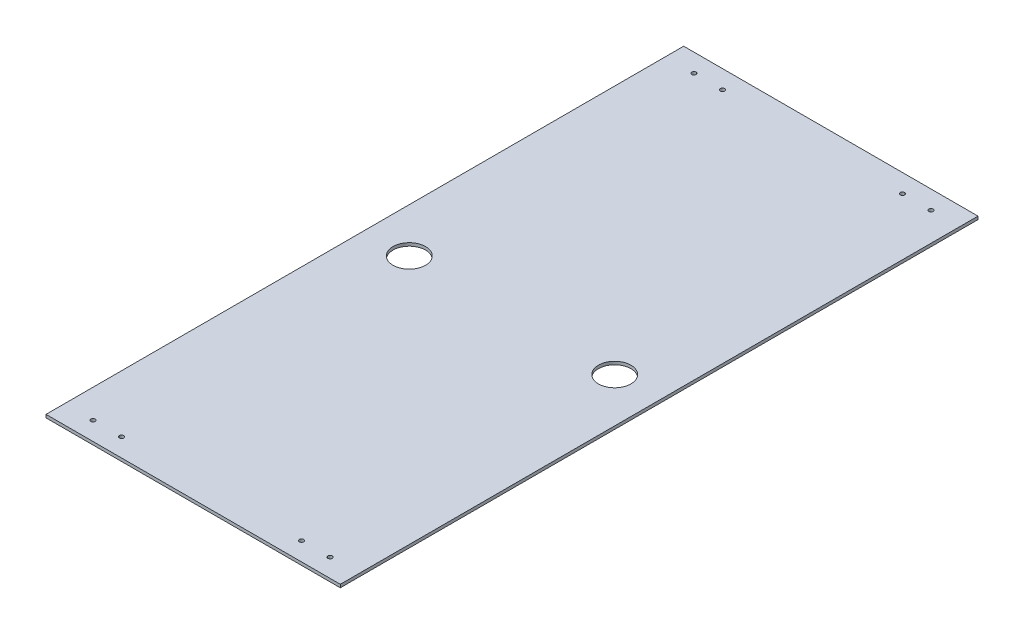
ISO-10303-21;
HEADER;
FILE_DESCRIPTION(('STEP AP214'),'2;1');
FILE_NAME('part.step','',(''),(''),'','','');
FILE_SCHEMA(('AUTOMOTIVE_DESIGN { 1 0 10303 214 1 1 1 1 }'));
ENDSEC;
DATA;
#1=APPLICATION_CONTEXT('core data for automotive mechanical design processes');
#2=APPLICATION_PROTOCOL_DEFINITION('international standard','automotive_design',2000,#1);
#3=PRODUCT_CONTEXT('',#1,'mechanical');
#4=PRODUCT('Part','Part','',(#3));
#5=PRODUCT_RELATED_PRODUCT_CATEGORY('part','',(#4));
#6=PRODUCT_DEFINITION_FORMATION('','',#4);
#7=PRODUCT_DEFINITION_CONTEXT('part definition',#1,'design');
#8=PRODUCT_DEFINITION('design','',#6,#7);
#9=PRODUCT_DEFINITION_SHAPE('','',#8);
#10=(LENGTH_UNIT() NAMED_UNIT(*) SI_UNIT(.MILLI.,.METRE.));
#11=(NAMED_UNIT(*) PLANE_ANGLE_UNIT() SI_UNIT($,.RADIAN.));
#12=(NAMED_UNIT(*) SI_UNIT($,.STERADIAN.) SOLID_ANGLE_UNIT());
#13=UNCERTAINTY_MEASURE_WITH_UNIT(LENGTH_MEASURE(1.E-05),#10,'distance_accuracy_value','');
#14=(GEOMETRIC_REPRESENTATION_CONTEXT(3) GLOBAL_UNCERTAINTY_ASSIGNED_CONTEXT((#13)) GLOBAL_UNIT_ASSIGNED_CONTEXT((#10,
#11,#12)) REPRESENTATION_CONTEXT('',''));
#15=CARTESIAN_POINT('',(0.,0.,0.));
#16=DIRECTION('',(0.,0.,1.));
#17=DIRECTION('',(1.,0.,0.));
#18=AXIS2_PLACEMENT_3D('',#15,#16,#17);
#19=CARTESIAN_POINT('',(0.,3.175,0.));
#20=DIRECTION('',(0.,-1.,0.));
#21=DIRECTION('',(0.,0.,-1.));
#22=AXIS2_PLACEMENT_3D('',#19,#20,#21);
#23=PLANE('',#22);
#24=DIRECTION('',(0.,0.,1.));
#25=VECTOR('',#24,1.);
#26=CARTESIAN_POINT('',(0.,3.175,0.));
#27=LINE('',#26,#25);
#28=CARTESIAN_POINT('',(0.,3.175,-660.4));
#29=VERTEX_POINT('',#28);
#30=CARTESIAN_POINT('',(0.,3.175,0.));
#31=VERTEX_POINT('',#30);
#32=EDGE_CURVE('E85',#29,#31,#27,.T.);
#33=ORIENTED_EDGE('',*,*,#32,.T.);
#34=DIRECTION('',(1.,0.,0.));
#35=VECTOR('',#34,1.);
#36=CARTESIAN_POINT('',(0.,3.175,0.));
#37=LINE('',#36,#35);
#38=CARTESIAN_POINT('',(304.8,3.175,0.));
#39=VERTEX_POINT('',#38);
#40=EDGE_CURVE('E80',#31,#39,#37,.T.);
#41=ORIENTED_EDGE('',*,*,#40,.T.);
#42=DIRECTION('',(0.,0.,-1.));
#43=VECTOR('',#42,1.);
#44=CARTESIAN_POINT('',(304.8,3.175,0.));
#45=LINE('',#44,#43);
#46=CARTESIAN_POINT('',(304.8,3.175,-660.4));
#47=VERTEX_POINT('',#46);
#48=EDGE_CURVE('E83',#39,#47,#45,.T.);
#49=ORIENTED_EDGE('',*,*,#48,.T.);
#50=DIRECTION('',(-1.,0.,0.));
#51=VECTOR('',#50,1.);
#52=CARTESIAN_POINT('',(0.,3.175,-660.4));
#53=LINE('',#52,#51);
#54=EDGE_CURVE('E50',#47,#29,#53,.T.);
#55=ORIENTED_EDGE('',*,*,#54,.T.);
#56=EDGE_LOOP('',(#33,#41,#49,#55));
#57=FACE_BOUND('',#56,.T.);
#58=CARTESIAN_POINT('',(46.0248,3.175,-330.2));
#59=DIRECTION('',(0.,1.,0.));
#60=DIRECTION('',(0.,0.,1.));
#61=AXIS2_PLACEMENT_3D('',#58,#59,#60);
#62=CIRCLE('',#61,16.8275);
#63=CARTESIAN_POINT('',(46.0248,3.175,-313.3725));
#64=VERTEX_POINT('',#63);
#65=EDGE_CURVE('E100',#64,#64,#62,.T.);
#66=ORIENTED_EDGE('',*,*,#65,.F.);
#67=EDGE_LOOP('',(#66));
#68=FACE_BOUND('',#67,.T.);
#69=CARTESIAN_POINT('',(258.7752,3.175,-330.2));
#70=DIRECTION('',(0.,1.,0.));
#71=DIRECTION('',(0.,0.,1.));
#72=AXIS2_PLACEMENT_3D('',#69,#70,#71);
#73=CIRCLE('',#72,16.8275);
#74=CARTESIAN_POINT('',(258.7752,3.175,-313.3725));
#75=VERTEX_POINT('',#74);
#76=EDGE_CURVE('E115',#75,#75,#73,.T.);
#77=ORIENTED_EDGE('',*,*,#76,.F.);
#78=EDGE_LOOP('',(#77));
#79=FACE_BOUND('',#78,.T.);
#80=CARTESIAN_POINT('',(29.6333333333333,3.175,-19.05));
#81=DIRECTION('',(0.,1.,0.));
#82=DIRECTION('',(0.,0.,1.));
#83=AXIS2_PLACEMENT_3D('',#80,#81,#82);
#84=CIRCLE('',#83,2.2479);
#85=CARTESIAN_POINT('',(29.6333333333333,3.175,-16.8021));
#86=VERTEX_POINT('',#85);
#87=EDGE_CURVE('E121',#86,#86,#84,.T.);
#88=ORIENTED_EDGE('',*,*,#87,.F.);
#89=EDGE_LOOP('',(#88));
#90=FACE_BOUND('',#89,.T.);
#91=CARTESIAN_POINT('',(59.2666666666667,3.175,-19.05));
#92=DIRECTION('',(0.,1.,0.));
#93=DIRECTION('',(0.,0.,1.));
#94=AXIS2_PLACEMENT_3D('',#91,#92,#93);
#95=CIRCLE('',#94,2.24789999999999);
#96=CARTESIAN_POINT('',(59.2666666666667,3.175,-16.8021));
#97=VERTEX_POINT('',#96);
#98=EDGE_CURVE('E127',#97,#97,#95,.T.);
#99=ORIENTED_EDGE('',*,*,#98,.F.);
#100=EDGE_LOOP('',(#99));
#101=FACE_BOUND('',#100,.T.);
#102=CARTESIAN_POINT('',(245.533333333333,3.175,-19.05));
#103=DIRECTION('',(0.,1.,0.));
#104=DIRECTION('',(0.,0.,1.));
#105=AXIS2_PLACEMENT_3D('',#102,#103,#104);
#106=CIRCLE('',#105,2.2479);
#107=CARTESIAN_POINT('',(245.533333333333,3.175,-16.8021));
#108=VERTEX_POINT('',#107);
#109=EDGE_CURVE('E133',#108,#108,#106,.T.);
#110=ORIENTED_EDGE('',*,*,#109,.F.);
#111=EDGE_LOOP('',(#110));
#112=FACE_BOUND('',#111,.T.);
#113=CARTESIAN_POINT('',(275.166666666667,3.175,-19.05));
#114=DIRECTION('',(0.,1.,0.));
#115=DIRECTION('',(0.,0.,1.));
#116=AXIS2_PLACEMENT_3D('',#113,#114,#115);
#117=CIRCLE('',#116,2.24790000000001);
#118=CARTESIAN_POINT('',(275.166666666667,3.175,-16.8021));
#119=VERTEX_POINT('',#118);
#120=EDGE_CURVE('E139',#119,#119,#117,.T.);
#121=ORIENTED_EDGE('',*,*,#120,.F.);
#122=EDGE_LOOP('',(#121));
#123=FACE_BOUND('',#122,.T.);
#124=CARTESIAN_POINT('',(275.166666666667,3.175,-641.35));
#125=DIRECTION('',(0.,1.,0.));
#126=DIRECTION('',(0.,0.,1.));
#127=AXIS2_PLACEMENT_3D('',#124,#125,#126);
#128=CIRCLE('',#127,2.24790000000002);
#129=CARTESIAN_POINT('',(275.166666666667,3.175,-639.1021));
#130=VERTEX_POINT('',#129);
#131=EDGE_CURVE('E145',#130,#130,#128,.T.);
#132=ORIENTED_EDGE('',*,*,#131,.F.);
#133=EDGE_LOOP('',(#132));
#134=FACE_BOUND('',#133,.T.);
#135=CARTESIAN_POINT('',(245.533333333333,3.175,-641.35));
#136=DIRECTION('',(0.,1.,0.));
#137=DIRECTION('',(0.,0.,1.));
#138=AXIS2_PLACEMENT_3D('',#135,#136,#137);
#139=CIRCLE('',#138,2.24790000000004);
#140=CARTESIAN_POINT('',(245.533333333333,3.175,-639.1021));
#141=VERTEX_POINT('',#140);
#142=EDGE_CURVE('E151',#141,#141,#139,.T.);
#143=ORIENTED_EDGE('',*,*,#142,.F.);
#144=EDGE_LOOP('',(#143));
#145=FACE_BOUND('',#144,.T.);
#146=CARTESIAN_POINT('',(59.2666666666667,3.175,-641.35));
#147=DIRECTION('',(0.,1.,0.));
#148=DIRECTION('',(0.,0.,1.));
#149=AXIS2_PLACEMENT_3D('',#146,#147,#148);
#150=CIRCLE('',#149,2.24790000000002);
#151=CARTESIAN_POINT('',(59.2666666666667,3.175,-639.1021));
#152=VERTEX_POINT('',#151);
#153=EDGE_CURVE('E157',#152,#152,#150,.T.);
#154=ORIENTED_EDGE('',*,*,#153,.F.);
#155=EDGE_LOOP('',(#154));
#156=FACE_BOUND('',#155,.T.);
#157=CARTESIAN_POINT('',(29.6333333333333,3.175,-641.35));
#158=DIRECTION('',(0.,1.,0.));
#159=DIRECTION('',(0.,0.,1.));
#160=AXIS2_PLACEMENT_3D('',#157,#158,#159);
#161=CIRCLE('',#160,2.24790000000003);
#162=CARTESIAN_POINT('',(29.6333333333333,3.175,-639.1021));
#163=VERTEX_POINT('',#162);
#164=EDGE_CURVE('E163',#163,#163,#161,.T.);
#165=ORIENTED_EDGE('',*,*,#164,.F.);
#166=EDGE_LOOP('',(#165));
#167=FACE_BOUND('',#166,.T.);
#168=ADVANCED_FACE('F33',(#57,#68,#79,#90,#101,#112,#123,#134,#145,#156,#167),#23,.F.);
#169=CARTESIAN_POINT('',(0.,0.,0.));
#170=DIRECTION('',(0.,-1.,0.));
#171=DIRECTION('',(0.,0.,-1.));
#172=AXIS2_PLACEMENT_3D('',#169,#170,#171);
#173=PLANE('',#172);
#174=CARTESIAN_POINT('',(59.2666666666667,0.,-641.35));
#175=DIRECTION('',(0.,1.,0.));
#176=DIRECTION('',(0.,0.,1.));
#177=AXIS2_PLACEMENT_3D('',#174,#175,#176);
#178=CIRCLE('',#177,2.24790000000002);
#179=CARTESIAN_POINT('',(59.2666666666667,0.,-639.1021));
#180=VERTEX_POINT('',#179);
#181=EDGE_CURVE('E160',#180,#180,#178,.T.);
#182=ORIENTED_EDGE('',*,*,#181,.T.);
#183=EDGE_LOOP('',(#182));
#184=FACE_BOUND('',#183,.T.);
#185=CARTESIAN_POINT('',(275.166666666667,0.,-641.35));
#186=DIRECTION('',(0.,1.,0.));
#187=DIRECTION('',(0.,0.,1.));
#188=AXIS2_PLACEMENT_3D('',#185,#186,#187);
#189=CIRCLE('',#188,2.24790000000002);
#190=CARTESIAN_POINT('',(275.166666666667,0.,-639.1021));
#191=VERTEX_POINT('',#190);
#192=EDGE_CURVE('E148',#191,#191,#189,.T.);
#193=ORIENTED_EDGE('',*,*,#192,.T.);
#194=EDGE_LOOP('',(#193));
#195=FACE_BOUND('',#194,.T.);
#196=CARTESIAN_POINT('',(245.533333333333,0.,-19.05));
#197=DIRECTION('',(0.,1.,0.));
#198=DIRECTION('',(0.,0.,1.));
#199=AXIS2_PLACEMENT_3D('',#196,#197,#198);
#200=CIRCLE('',#199,2.2479);
#201=CARTESIAN_POINT('',(245.533333333333,0.,-16.8021));
#202=VERTEX_POINT('',#201);
#203=EDGE_CURVE('E136',#202,#202,#200,.T.);
#204=ORIENTED_EDGE('',*,*,#203,.T.);
#205=EDGE_LOOP('',(#204));
#206=FACE_BOUND('',#205,.T.);
#207=CARTESIAN_POINT('',(29.6333333333333,0.,-19.05));
#208=DIRECTION('',(0.,1.,0.));
#209=DIRECTION('',(0.,0.,1.));
#210=AXIS2_PLACEMENT_3D('',#207,#208,#209);
#211=CIRCLE('',#210,2.2479);
#212=CARTESIAN_POINT('',(29.6333333333333,0.,-16.8021));
#213=VERTEX_POINT('',#212);
#214=EDGE_CURVE('E124',#213,#213,#211,.T.);
#215=ORIENTED_EDGE('',*,*,#214,.T.);
#216=EDGE_LOOP('',(#215));
#217=FACE_BOUND('',#216,.T.);
#218=CARTESIAN_POINT('',(46.0248,0.,-330.2));
#219=DIRECTION('',(0.,1.,0.));
#220=DIRECTION('',(0.,0.,1.));
#221=AXIS2_PLACEMENT_3D('',#218,#219,#220);
#222=CIRCLE('',#221,16.8275);
#223=CARTESIAN_POINT('',(46.0248,0.,-313.3725));
#224=VERTEX_POINT('',#223);
#225=EDGE_CURVE('E112',#224,#224,#222,.T.);
#226=ORIENTED_EDGE('',*,*,#225,.T.);
#227=EDGE_LOOP('',(#226));
#228=FACE_BOUND('',#227,.T.);
#229=DIRECTION('',(0.,0.,1.));
#230=VECTOR('',#229,1.);
#231=CARTESIAN_POINT('',(0.,0.,0.));
#232=LINE('',#231,#230);
#233=CARTESIAN_POINT('',(0.,0.,-660.4));
#234=VERTEX_POINT('',#233);
#235=CARTESIAN_POINT('',(0.,0.,0.));
#236=VERTEX_POINT('',#235);
#237=EDGE_CURVE('E97',#234,#236,#232,.T.);
#238=ORIENTED_EDGE('',*,*,#237,.F.);
#239=DIRECTION('',(-1.,0.,0.));
#240=VECTOR('',#239,1.);
#241=CARTESIAN_POINT('',(0.,0.,-660.4));
#242=LINE('',#241,#240);
#243=CARTESIAN_POINT('',(304.8,0.,-660.4));
#244=VERTEX_POINT('',#243);
#245=EDGE_CURVE('E73',#244,#234,#242,.T.);
#246=ORIENTED_EDGE('',*,*,#245,.F.);
#247=DIRECTION('',(0.,0.,-1.));
#248=VECTOR('',#247,1.);
#249=CARTESIAN_POINT('',(304.8,0.,0.));
#250=LINE('',#249,#248);
#251=CARTESIAN_POINT('',(304.8,0.,0.));
#252=VERTEX_POINT('',#251);
#253=EDGE_CURVE('E67',#252,#244,#250,.T.);
#254=ORIENTED_EDGE('',*,*,#253,.F.);
#255=DIRECTION('',(1.,0.,0.));
#256=VECTOR('',#255,1.);
#257=CARTESIAN_POINT('',(0.,0.,0.));
#258=LINE('',#257,#256);
#259=EDGE_CURVE('E89',#236,#252,#258,.T.);
#260=ORIENTED_EDGE('',*,*,#259,.F.);
#261=EDGE_LOOP('',(#238,#246,#254,#260));
#262=FACE_BOUND('',#261,.T.);
#263=CARTESIAN_POINT('',(258.7752,0.,-330.2));
#264=DIRECTION('',(0.,1.,0.));
#265=DIRECTION('',(0.,0.,1.));
#266=AXIS2_PLACEMENT_3D('',#263,#264,#265);
#267=CIRCLE('',#266,16.8275);
#268=CARTESIAN_POINT('',(258.7752,0.,-313.3725));
#269=VERTEX_POINT('',#268);
#270=EDGE_CURVE('E118',#269,#269,#267,.T.);
#271=ORIENTED_EDGE('',*,*,#270,.T.);
#272=EDGE_LOOP('',(#271));
#273=FACE_BOUND('',#272,.T.);
#274=CARTESIAN_POINT('',(59.2666666666667,0.,-19.05));
#275=DIRECTION('',(0.,1.,0.));
#276=DIRECTION('',(0.,0.,1.));
#277=AXIS2_PLACEMENT_3D('',#274,#275,#276);
#278=CIRCLE('',#277,2.24789999999999);
#279=CARTESIAN_POINT('',(59.2666666666667,0.,-16.8021));
#280=VERTEX_POINT('',#279);
#281=EDGE_CURVE('E130',#280,#280,#278,.T.);
#282=ORIENTED_EDGE('',*,*,#281,.T.);
#283=EDGE_LOOP('',(#282));
#284=FACE_BOUND('',#283,.T.);
#285=CARTESIAN_POINT('',(275.166666666667,0.,-19.05));
#286=DIRECTION('',(0.,1.,0.));
#287=DIRECTION('',(0.,0.,1.));
#288=AXIS2_PLACEMENT_3D('',#285,#286,#287);
#289=CIRCLE('',#288,2.24790000000001);
#290=CARTESIAN_POINT('',(275.166666666667,0.,-16.8021));
#291=VERTEX_POINT('',#290);
#292=EDGE_CURVE('E142',#291,#291,#289,.T.);
#293=ORIENTED_EDGE('',*,*,#292,.T.);
#294=EDGE_LOOP('',(#293));
#295=FACE_BOUND('',#294,.T.);
#296=CARTESIAN_POINT('',(245.533333333333,0.,-641.35));
#297=DIRECTION('',(0.,1.,0.));
#298=DIRECTION('',(0.,0.,1.));
#299=AXIS2_PLACEMENT_3D('',#296,#297,#298);
#300=CIRCLE('',#299,2.24790000000004);
#301=CARTESIAN_POINT('',(245.533333333333,0.,-639.1021));
#302=VERTEX_POINT('',#301);
#303=EDGE_CURVE('E154',#302,#302,#300,.T.);
#304=ORIENTED_EDGE('',*,*,#303,.T.);
#305=EDGE_LOOP('',(#304));
#306=FACE_BOUND('',#305,.T.);
#307=CARTESIAN_POINT('',(29.6333333333333,0.,-641.35));
#308=DIRECTION('',(0.,1.,0.));
#309=DIRECTION('',(0.,0.,1.));
#310=AXIS2_PLACEMENT_3D('',#307,#308,#309);
#311=CIRCLE('',#310,2.24790000000003);
#312=CARTESIAN_POINT('',(29.6333333333333,0.,-639.1021));
#313=VERTEX_POINT('',#312);
#314=EDGE_CURVE('E166',#313,#313,#311,.T.);
#315=ORIENTED_EDGE('',*,*,#314,.T.);
#316=EDGE_LOOP('',(#315));
#317=FACE_BOUND('',#316,.T.);
#318=ADVANCED_FACE('F108',(#184,#195,#206,#217,#228,#262,#273,#284,#295,#306,#317),#173,.T.);
#319=CARTESIAN_POINT('',(0.,3.175,0.));
#320=DIRECTION('',(1.,0.,0.));
#321=DIRECTION('',(0.,0.,-1.));
#322=AXIS2_PLACEMENT_3D('',#319,#320,#321);
#323=PLANE('',#322);
#324=ORIENTED_EDGE('',*,*,#237,.T.);
#325=DIRECTION('',(0.,-1.,0.));
#326=VECTOR('',#325,1.);
#327=CARTESIAN_POINT('',(0.,3.175,0.));
#328=LINE('',#327,#326);
#329=EDGE_CURVE('E11',#31,#236,#328,.T.);
#330=ORIENTED_EDGE('',*,*,#329,.F.);
#331=ORIENTED_EDGE('',*,*,#32,.F.);
#332=DIRECTION('',(0.,-1.,0.));
#333=VECTOR('',#332,1.);
#334=CARTESIAN_POINT('',(0.,3.175,-660.4));
#335=LINE('',#334,#333);
#336=EDGE_CURVE('E93',#29,#234,#335,.T.);
#337=ORIENTED_EDGE('',*,*,#336,.T.);
#338=EDGE_LOOP('',(#324,#330,#331,#337));
#339=FACE_BOUND('',#338,.T.);
#340=ADVANCED_FACE('F35',(#339),#323,.F.);
#341=CARTESIAN_POINT('',(0.,3.175,0.));
#342=DIRECTION('',(0.,0.,-1.));
#343=DIRECTION('',(-1.,0.,0.));
#344=AXIS2_PLACEMENT_3D('',#341,#342,#343);
#345=PLANE('',#344);
#346=ORIENTED_EDGE('',*,*,#259,.T.);
#347=DIRECTION('',(0.,-1.,0.));
#348=VECTOR('',#347,1.);
#349=CARTESIAN_POINT('',(304.8,3.175,0.));
#350=LINE('',#349,#348);
#351=EDGE_CURVE('E42',#39,#252,#350,.T.);
#352=ORIENTED_EDGE('',*,*,#351,.F.);
#353=ORIENTED_EDGE('',*,*,#40,.F.);
#354=ORIENTED_EDGE('',*,*,#329,.T.);
#355=EDGE_LOOP('',(#346,#352,#353,#354));
#356=FACE_BOUND('',#355,.T.);
#357=ADVANCED_FACE('F88',(#356),#345,.F.);
#358=CARTESIAN_POINT('',(304.8,3.175,0.));
#359=DIRECTION('',(-1.,0.,0.));
#360=DIRECTION('',(0.,0.,1.));
#361=AXIS2_PLACEMENT_3D('',#358,#359,#360);
#362=PLANE('',#361);
#363=ORIENTED_EDGE('',*,*,#253,.T.);
#364=DIRECTION('',(0.,-1.,0.));
#365=VECTOR('',#364,1.);
#366=CARTESIAN_POINT('',(304.8,3.175,-660.4));
#367=LINE('',#366,#365);
#368=EDGE_CURVE('E90',#47,#244,#367,.T.);
#369=ORIENTED_EDGE('',*,*,#368,.F.);
#370=ORIENTED_EDGE('',*,*,#48,.F.);
#371=ORIENTED_EDGE('',*,*,#351,.T.);
#372=EDGE_LOOP('',(#363,#369,#370,#371));
#373=FACE_BOUND('',#372,.T.);
#374=ADVANCED_FACE('F91',(#373),#362,.F.);
#375=CARTESIAN_POINT('',(0.,3.175,-660.4));
#376=DIRECTION('',(0.,0.,1.));
#377=DIRECTION('',(1.,0.,0.));
#378=AXIS2_PLACEMENT_3D('',#375,#376,#377);
#379=PLANE('',#378);
#380=ORIENTED_EDGE('',*,*,#245,.T.);
#381=ORIENTED_EDGE('',*,*,#336,.F.);
#382=ORIENTED_EDGE('',*,*,#54,.F.);
#383=ORIENTED_EDGE('',*,*,#368,.T.);
#384=EDGE_LOOP('',(#380,#381,#382,#383));
#385=FACE_BOUND('',#384,.T.);
#386=ADVANCED_FACE('F105',(#385),#379,.F.);
#387=CARTESIAN_POINT('',(46.0248,3.175,-330.2));
#388=DIRECTION('',(0.,-1.,0.));
#389=DIRECTION('',(0.,0.,-1.));
#390=AXIS2_PLACEMENT_3D('',#387,#388,#389);
#391=CYLINDRICAL_SURFACE('',#390,16.8275);
#392=ORIENTED_EDGE('',*,*,#65,.T.);
#393=EDGE_LOOP('',(#392));
#394=FACE_BOUND('',#393,.T.);
#395=ORIENTED_EDGE('',*,*,#225,.F.);
#396=EDGE_LOOP('',(#395));
#397=FACE_BOUND('',#396,.T.);
#398=ADVANCED_FACE('F183',(#394,#397),#391,.F.);
#399=CARTESIAN_POINT('',(258.7752,3.175,-330.2));
#400=DIRECTION('',(0.,-1.,0.));
#401=DIRECTION('',(0.,0.,-1.));
#402=AXIS2_PLACEMENT_3D('',#399,#400,#401);
#403=CYLINDRICAL_SURFACE('',#402,16.8275);
#404=ORIENTED_EDGE('',*,*,#76,.T.);
#405=EDGE_LOOP('',(#404));
#406=FACE_BOUND('',#405,.T.);
#407=ORIENTED_EDGE('',*,*,#270,.F.);
#408=EDGE_LOOP('',(#407));
#409=FACE_BOUND('',#408,.T.);
#410=ADVANCED_FACE('F229',(#406,#409),#403,.F.);
#411=CARTESIAN_POINT('',(29.6333333333333,3.175,-19.05));
#412=DIRECTION('',(0.,-1.,0.));
#413=DIRECTION('',(0.,0.,-1.));
#414=AXIS2_PLACEMENT_3D('',#411,#412,#413);
#415=CYLINDRICAL_SURFACE('',#414,2.2479);
#416=ORIENTED_EDGE('',*,*,#87,.T.);
#417=EDGE_LOOP('',(#416));
#418=FACE_BOUND('',#417,.T.);
#419=ORIENTED_EDGE('',*,*,#214,.F.);
#420=EDGE_LOOP('',(#419));
#421=FACE_BOUND('',#420,.T.);
#422=ADVANCED_FACE('F237',(#418,#421),#415,.F.);
#423=CARTESIAN_POINT('',(59.2666666666667,3.175,-19.05));
#424=DIRECTION('',(0.,-1.,0.));
#425=DIRECTION('',(0.,0.,-1.));
#426=AXIS2_PLACEMENT_3D('',#423,#424,#425);
#427=CYLINDRICAL_SURFACE('',#426,2.24789999999999);
#428=ORIENTED_EDGE('',*,*,#98,.T.);
#429=EDGE_LOOP('',(#428));
#430=FACE_BOUND('',#429,.T.);
#431=ORIENTED_EDGE('',*,*,#281,.F.);
#432=EDGE_LOOP('',(#431));
#433=FACE_BOUND('',#432,.T.);
#434=ADVANCED_FACE('F245',(#430,#433),#427,.F.);
#435=CARTESIAN_POINT('',(245.533333333333,3.175,-19.05));
#436=DIRECTION('',(0.,-1.,0.));
#437=DIRECTION('',(0.,0.,-1.));
#438=AXIS2_PLACEMENT_3D('',#435,#436,#437);
#439=CYLINDRICAL_SURFACE('',#438,2.2479);
#440=ORIENTED_EDGE('',*,*,#109,.T.);
#441=EDGE_LOOP('',(#440));
#442=FACE_BOUND('',#441,.T.);
#443=ORIENTED_EDGE('',*,*,#203,.F.);
#444=EDGE_LOOP('',(#443));
#445=FACE_BOUND('',#444,.T.);
#446=ADVANCED_FACE('F254',(#442,#445),#439,.F.);
#447=CARTESIAN_POINT('',(275.166666666667,3.175,-19.05));
#448=DIRECTION('',(0.,-1.,0.));
#449=DIRECTION('',(0.,0.,-1.));
#450=AXIS2_PLACEMENT_3D('',#447,#448,#449);
#451=CYLINDRICAL_SURFACE('',#450,2.24790000000001);
#452=ORIENTED_EDGE('',*,*,#120,.T.);
#453=EDGE_LOOP('',(#452));
#454=FACE_BOUND('',#453,.T.);
#455=ORIENTED_EDGE('',*,*,#292,.F.);
#456=EDGE_LOOP('',(#455));
#457=FACE_BOUND('',#456,.T.);
#458=ADVANCED_FACE('F263',(#454,#457),#451,.F.);
#459=CARTESIAN_POINT('',(275.166666666667,3.175,-641.35));
#460=DIRECTION('',(0.,-1.,0.));
#461=DIRECTION('',(0.,0.,-1.));
#462=AXIS2_PLACEMENT_3D('',#459,#460,#461);
#463=CYLINDRICAL_SURFACE('',#462,2.24790000000002);
#464=ORIENTED_EDGE('',*,*,#131,.T.);
#465=EDGE_LOOP('',(#464));
#466=FACE_BOUND('',#465,.T.);
#467=ORIENTED_EDGE('',*,*,#192,.F.);
#468=EDGE_LOOP('',(#467));
#469=FACE_BOUND('',#468,.T.);
#470=ADVANCED_FACE('F272',(#466,#469),#463,.F.);
#471=CARTESIAN_POINT('',(245.533333333333,3.175,-641.35));
#472=DIRECTION('',(0.,-1.,0.));
#473=DIRECTION('',(0.,0.,-1.));
#474=AXIS2_PLACEMENT_3D('',#471,#472,#473);
#475=CYLINDRICAL_SURFACE('',#474,2.24790000000004);
#476=ORIENTED_EDGE('',*,*,#142,.T.);
#477=EDGE_LOOP('',(#476));
#478=FACE_BOUND('',#477,.T.);
#479=ORIENTED_EDGE('',*,*,#303,.F.);
#480=EDGE_LOOP('',(#479));
#481=FACE_BOUND('',#480,.T.);
#482=ADVANCED_FACE('F281',(#478,#481),#475,.F.);
#483=CARTESIAN_POINT('',(59.2666666666667,3.175,-641.35));
#484=DIRECTION('',(0.,-1.,0.));
#485=DIRECTION('',(0.,0.,-1.));
#486=AXIS2_PLACEMENT_3D('',#483,#484,#485);
#487=CYLINDRICAL_SURFACE('',#486,2.24790000000002);
#488=ORIENTED_EDGE('',*,*,#153,.T.);
#489=EDGE_LOOP('',(#488));
#490=FACE_BOUND('',#489,.T.);
#491=ORIENTED_EDGE('',*,*,#181,.F.);
#492=EDGE_LOOP('',(#491));
#493=FACE_BOUND('',#492,.T.);
#494=ADVANCED_FACE('F290',(#490,#493),#487,.F.);
#495=CARTESIAN_POINT('',(29.6333333333333,3.175,-641.35));
#496=DIRECTION('',(0.,-1.,0.));
#497=DIRECTION('',(0.,0.,-1.));
#498=AXIS2_PLACEMENT_3D('',#495,#496,#497);
#499=CYLINDRICAL_SURFACE('',#498,2.24790000000003);
#500=ORIENTED_EDGE('',*,*,#164,.T.);
#501=EDGE_LOOP('',(#500));
#502=FACE_BOUND('',#501,.T.);
#503=ORIENTED_EDGE('',*,*,#314,.F.);
#504=EDGE_LOOP('',(#503));
#505=FACE_BOUND('',#504,.T.);
#506=ADVANCED_FACE('F172',(#502,#505),#499,.F.);
#507=CLOSED_SHELL('',(#168,#318,#340,#357,#374,#386,#398,#410,#422,#434,#446,#458,#470,#482,
#494,#506));
#508=MANIFOLD_SOLID_BREP('B2',#507);
#509=ADVANCED_BREP_SHAPE_REPRESENTATION('',(#18,#508),#14);
#510=SHAPE_DEFINITION_REPRESENTATION(#9,#509);
ENDSEC;
END-ISO-10303-21;
